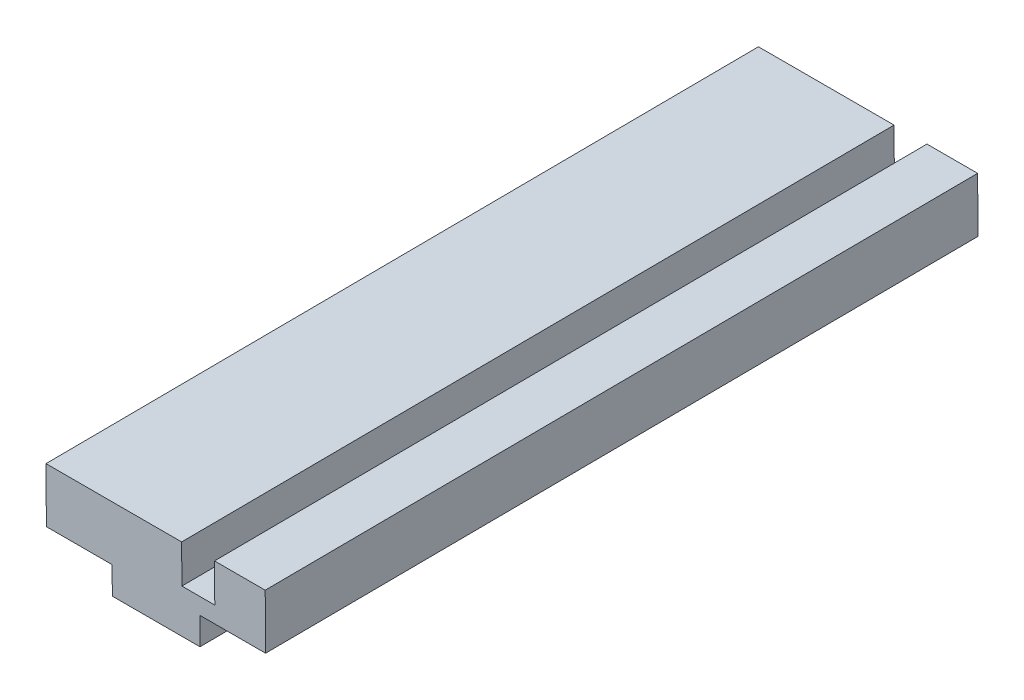
ISO-10303-21;
HEADER;
FILE_DESCRIPTION(('STEP AP214'),'2;1');
FILE_NAME('part.step','',(''),(''),'','','');
FILE_SCHEMA(('AUTOMOTIVE_DESIGN { 1 0 10303 214 1 1 1 1 }'));
ENDSEC;
DATA;
#1=APPLICATION_CONTEXT('core data for automotive mechanical design processes');
#2=APPLICATION_PROTOCOL_DEFINITION('international standard','automotive_design',2000,#1);
#3=PRODUCT_CONTEXT('',#1,'mechanical');
#4=PRODUCT('Part','Part','',(#3));
#5=PRODUCT_RELATED_PRODUCT_CATEGORY('part','',(#4));
#6=PRODUCT_DEFINITION_FORMATION('','',#4);
#7=PRODUCT_DEFINITION_CONTEXT('part definition',#1,'design');
#8=PRODUCT_DEFINITION('design','',#6,#7);
#9=PRODUCT_DEFINITION_SHAPE('','',#8);
#10=(LENGTH_UNIT() NAMED_UNIT(*) SI_UNIT(.MILLI.,.METRE.));
#11=(NAMED_UNIT(*) PLANE_ANGLE_UNIT() SI_UNIT($,.RADIAN.));
#12=(NAMED_UNIT(*) SI_UNIT($,.STERADIAN.) SOLID_ANGLE_UNIT());
#13=UNCERTAINTY_MEASURE_WITH_UNIT(LENGTH_MEASURE(1.E-05),#10,'distance_accuracy_value','');
#14=(GEOMETRIC_REPRESENTATION_CONTEXT(3) GLOBAL_UNCERTAINTY_ASSIGNED_CONTEXT((#13)) GLOBAL_UNIT_ASSIGNED_CONTEXT((#10,
#11,#12)) REPRESENTATION_CONTEXT('',''));
#15=CARTESIAN_POINT('',(0.,0.,0.));
#16=DIRECTION('',(0.,0.,1.));
#17=DIRECTION('',(1.,0.,0.));
#18=AXIS2_PLACEMENT_3D('',#15,#16,#17);
#19=CARTESIAN_POINT('',(0.,10.6828155324661,-140.362156680872));
#20=DIRECTION('',(0.,0.999977218101321,0.00675005765475413));
#21=DIRECTION('',(0.,-0.00675005765475413,0.999977218101321));
#22=AXIS2_PLACEMENT_3D('',#19,#20,#21);
#23=PLANE('',#22);
#24=DIRECTION('',(-1.,0.,0.));
#25=VECTOR('',#24,1.);
#26=CARTESIAN_POINT('',(0.,9.80530803734802,-10.3651183277));
#27=LINE('',#26,#25);
#28=CARTESIAN_POINT('',(7.49999999999996,9.80530803734802,-10.3651183277));
#29=VERTEX_POINT('',#28);
#30=CARTESIAN_POINT('',(-8.50000000000004,9.80530803734802,-10.3651183277));
#31=VERTEX_POINT('',#30);
#32=EDGE_CURVE('E154',#29,#31,#27,.T.);
#33=ORIENTED_EDGE('',*,*,#32,.T.);
#34=DIRECTION('',(0.,-0.00675005765475413,0.999977218101321));
#35=VECTOR('',#34,1.);
#36=CARTESIAN_POINT('',(-8.50000000000007,10.6828155324661,-140.362156680872));
#37=LINE('',#36,#35);
#38=CARTESIAN_POINT('',(-8.50000000000007,10.6828155324661,-140.362156680872));
#39=VERTEX_POINT('',#38);
#40=EDGE_CURVE('E11',#39,#31,#37,.T.);
#41=ORIENTED_EDGE('',*,*,#40,.F.);
#42=DIRECTION('',(-1.,0.,0.));
#43=VECTOR('',#42,1.);
#44=CARTESIAN_POINT('',(0.,10.6828155324661,-140.362156680872));
#45=LINE('',#44,#43);
#46=CARTESIAN_POINT('',(7.49999999999993,10.6828155324661,-140.362156680872));
#47=VERTEX_POINT('',#46);
#48=EDGE_CURVE('E176',#47,#39,#45,.T.);
#49=ORIENTED_EDGE('',*,*,#48,.F.);
#50=DIRECTION('',(0.,-0.00675005765475413,0.999977218101321));
#51=VECTOR('',#50,1.);
#52=CARTESIAN_POINT('',(7.49999999999993,10.6828155324661,-140.362156680872));
#53=LINE('',#52,#51);
#54=EDGE_CURVE('E38',#47,#29,#53,.T.);
#55=ORIENTED_EDGE('',*,*,#54,.T.);
#56=EDGE_LOOP('',(#33,#41,#49,#55));
#57=FACE_BOUND('',#56,.T.);
#58=ADVANCED_FACE('F35',(#57),#23,.F.);
#59=CARTESIAN_POINT('',(-8.50000000000007,0.947917809468825,-140.427869298823));
#60=DIRECTION('',(1.,0.,0.));
#61=DIRECTION('',(0.,0.,-1.));
#62=AXIS2_PLACEMENT_3D('',#59,#60,#61);
#63=PLANE('',#62);
#64=DIRECTION('',(0.,0.999977218101321,0.00675005765475411));
#65=VECTOR('',#64,1.);
#66=CARTESIAN_POINT('',(-8.50000000000004,0.0704103143507889,-10.4308309456516));
#67=LINE('',#66,#65);
#68=CARTESIAN_POINT('',(-8.50000000000004,14.8051941278546,-10.3313680394262));
#69=VERTEX_POINT('',#68);
#70=EDGE_CURVE('E90',#31,#69,#67,.T.);
#71=ORIENTED_EDGE('',*,*,#70,.T.);
#72=DIRECTION('',(0.,-0.00675005765475413,0.999977218101321));
#73=VECTOR('',#72,1.);
#74=CARTESIAN_POINT('',(-8.50000000000007,15.6827016229727,-140.328406392598));
#75=LINE('',#74,#73);
#76=CARTESIAN_POINT('',(-8.50000000000007,15.6827016229727,-140.328406392598));
#77=VERTEX_POINT('',#76);
#78=EDGE_CURVE('E44',#77,#69,#75,.T.);
#79=ORIENTED_EDGE('',*,*,#78,.F.);
#80=DIRECTION('',(0.,0.999977218101321,0.00675005765475411));
#81=VECTOR('',#80,1.);
#82=CARTESIAN_POINT('',(-8.50000000000007,0.947917809468825,-140.427869298823));
#83=LINE('',#82,#81);
#84=EDGE_CURVE('E52',#39,#77,#83,.T.);
#85=ORIENTED_EDGE('',*,*,#84,.F.);
#86=ORIENTED_EDGE('',*,*,#40,.T.);
#87=EDGE_LOOP('',(#71,#79,#85,#86));
#88=FACE_BOUND('',#87,.T.);
#89=ADVANCED_FACE('F221',(#88),#63,.F.);
#90=CARTESIAN_POINT('',(0.,15.6827016229727,-140.328406392598));
#91=DIRECTION('',(0.,0.999977218101321,0.00675005765475413));
#92=DIRECTION('',(0.,-0.00675005765475413,0.999977218101321));
#93=AXIS2_PLACEMENT_3D('',#90,#91,#92);
#94=PLANE('',#93);
#95=DIRECTION('',(-1.,0.,0.));
#96=VECTOR('',#95,1.);
#97=CARTESIAN_POINT('',(0.,14.8051941278546,-10.3313680394262));
#98=LINE('',#97,#96);
#99=CARTESIAN_POINT('',(-20.5,14.8051941278546,-10.3313680394262));
#100=VERTEX_POINT('',#99);
#101=EDGE_CURVE('E139',#69,#100,#98,.T.);
#102=ORIENTED_EDGE('',*,*,#101,.T.);
#103=DIRECTION('',(0.,-0.00675005765475413,0.999977218101321));
#104=VECTOR('',#103,1.);
#105=CARTESIAN_POINT('',(-20.5000000000001,15.6827016229727,-140.328406392598));
#106=LINE('',#105,#104);
#107=CARTESIAN_POINT('',(-20.5000000000001,15.6827016229727,-140.328406392598));
#108=VERTEX_POINT('',#107);
#109=EDGE_CURVE('E137',#108,#100,#106,.T.);
#110=ORIENTED_EDGE('',*,*,#109,.F.);
#111=DIRECTION('',(-1.,0.,0.));
#112=VECTOR('',#111,1.);
#113=CARTESIAN_POINT('',(0.,15.6827016229727,-140.328406392598));
#114=LINE('',#113,#112);
#115=EDGE_CURVE('E128',#77,#108,#114,.T.);
#116=ORIENTED_EDGE('',*,*,#115,.F.);
#117=ORIENTED_EDGE('',*,*,#78,.T.);
#118=EDGE_LOOP('',(#102,#110,#116,#117));
#119=FACE_BOUND('',#118,.T.);
#120=ADVANCED_FACE('F138',(#119),#94,.F.);
#121=CARTESIAN_POINT('',(-20.5000000000001,0.947917809468825,-140.427869298823));
#122=DIRECTION('',(1.,0.,0.));
#123=DIRECTION('',(0.,0.,-1.));
#124=AXIS2_PLACEMENT_3D('',#121,#122,#123);
#125=PLANE('',#124);
#126=DIRECTION('',(0.,0.999977218101321,0.00675005765475411));
#127=VECTOR('',#126,1.);
#128=CARTESIAN_POINT('',(-20.5,0.0704103143507888,-10.4308309456516));
#129=LINE('',#128,#127);
#130=CARTESIAN_POINT('',(-20.5,24.8049663088678,-10.2638674628787));
#131=VERTEX_POINT('',#130);
#132=EDGE_CURVE('E173',#100,#131,#129,.T.);
#133=ORIENTED_EDGE('',*,*,#132,.T.);
#134=DIRECTION('',(0.,-0.00675005765475413,0.999977218101321));
#135=VECTOR('',#134,1.);
#136=CARTESIAN_POINT('',(-20.5000000000001,25.6824738039859,-140.26090581605));
#137=LINE('',#136,#135);
#138=CARTESIAN_POINT('',(-20.5000000000001,25.6824738039859,-140.26090581605));
#139=VERTEX_POINT('',#138);
#140=EDGE_CURVE('E142',#139,#131,#137,.T.);
#141=ORIENTED_EDGE('',*,*,#140,.F.);
#142=DIRECTION('',(0.,0.999977218101321,0.00675005765475411));
#143=VECTOR('',#142,1.);
#144=CARTESIAN_POINT('',(-20.5000000000001,0.947917809468825,-140.427869298823));
#145=LINE('',#144,#143);
#146=EDGE_CURVE('E132',#108,#139,#145,.T.);
#147=ORIENTED_EDGE('',*,*,#146,.F.);
#148=ORIENTED_EDGE('',*,*,#109,.T.);
#149=EDGE_LOOP('',(#133,#141,#147,#148));
#150=FACE_BOUND('',#149,.T.);
#151=ADVANCED_FACE('F144',(#150),#125,.F.);
#152=CARTESIAN_POINT('',(0.,25.6824738039859,-140.26090581605));
#153=DIRECTION('',(0.,-0.999977218101321,-0.00675005765475413));
#154=DIRECTION('',(0.,0.00675005765475413,-0.999977218101321));
#155=AXIS2_PLACEMENT_3D('',#152,#153,#154);
#156=PLANE('',#155);
#157=DIRECTION('',(1.,0.,0.));
#158=VECTOR('',#157,1.);
#159=CARTESIAN_POINT('',(0.,24.8049663088678,-10.2638674628787));
#160=LINE('',#159,#158);
#161=CARTESIAN_POINT('',(4.24994919999996,24.8049663088678,-10.2638674628787));
#162=VERTEX_POINT('',#161);
#163=EDGE_CURVE('E171',#131,#162,#160,.T.);
#164=ORIENTED_EDGE('',*,*,#163,.T.);
#165=DIRECTION('',(0.,-0.00675005765475413,0.999977218101321));
#166=VECTOR('',#165,1.);
#167=CARTESIAN_POINT('',(4.24994919999993,25.6824738039859,-140.26090581605));
#168=LINE('',#167,#166);
#169=CARTESIAN_POINT('',(4.24994919999993,25.6824738039859,-140.26090581605));
#170=VERTEX_POINT('',#169);
#171=EDGE_CURVE('E180',#170,#162,#168,.T.);
#172=ORIENTED_EDGE('',*,*,#171,.F.);
#173=DIRECTION('',(1.,0.,0.));
#174=VECTOR('',#173,1.);
#175=CARTESIAN_POINT('',(0.,25.6824738039859,-140.26090581605));
#176=LINE('',#175,#174);
#177=EDGE_CURVE('E147',#139,#170,#176,.T.);
#178=ORIENTED_EDGE('',*,*,#177,.F.);
#179=ORIENTED_EDGE('',*,*,#140,.T.);
#180=EDGE_LOOP('',(#164,#172,#178,#179));
#181=FACE_BOUND('',#180,.T.);
#182=ADVANCED_FACE('F234',(#181),#156,.F.);
#183=CARTESIAN_POINT('',(4.24994919999991,0.947917809468822,-140.427869298823));
#184=DIRECTION('',(-1.,0.,0.));
#185=DIRECTION('',(0.,-1.,0.));
#186=AXIS2_PLACEMENT_3D('',#183,#184,#185);
#187=PLANE('',#186);
#188=DIRECTION('',(0.,-0.999977218101321,-0.00675005765475411));
#189=VECTOR('',#188,1.);
#190=CARTESIAN_POINT('',(4.24994919999994,0.0704103143507852,-10.4308309456516));
#191=LINE('',#190,#189);
#192=CARTESIAN_POINT('',(4.24994919999996,17.8051257821587,-10.311117866462));
#193=VERTEX_POINT('',#192);
#194=EDGE_CURVE('E169',#162,#193,#191,.T.);
#195=ORIENTED_EDGE('',*,*,#194,.T.);
#196=DIRECTION('',(0.,-0.00675005765475413,0.999977218101321));
#197=VECTOR('',#196,1.);
#198=CARTESIAN_POINT('',(4.24994919999993,18.6826332772767,-140.308156219634));
#199=LINE('',#198,#197);
#200=CARTESIAN_POINT('',(4.24994919999993,18.6826332772767,-140.308156219634));
#201=VERTEX_POINT('',#200);
#202=EDGE_CURVE('E183',#201,#193,#199,.T.);
#203=ORIENTED_EDGE('',*,*,#202,.F.);
#204=DIRECTION('',(0.,-0.999977218101321,-0.00675005765475411));
#205=VECTOR('',#204,1.);
#206=CARTESIAN_POINT('',(4.24994919999991,0.947917809468822,-140.427869298823));
#207=LINE('',#206,#205);
#208=EDGE_CURVE('E149',#170,#201,#207,.T.);
#209=ORIENTED_EDGE('',*,*,#208,.F.);
#210=ORIENTED_EDGE('',*,*,#171,.T.);
#211=EDGE_LOOP('',(#195,#203,#209,#210));
#212=FACE_BOUND('',#211,.T.);
#213=ADVANCED_FACE('F237',(#212),#187,.F.);
#214=CARTESIAN_POINT('',(0.,18.6826332772767,-140.308156219634));
#215=DIRECTION('',(0.,-0.999977218101321,-0.00675005765475413));
#216=DIRECTION('',(0.,0.00675005765475413,-0.999977218101321));
#217=AXIS2_PLACEMENT_3D('',#214,#215,#216);
#218=PLANE('',#217);
#219=DIRECTION('',(1.,0.,0.));
#220=VECTOR('',#219,1.);
#221=CARTESIAN_POINT('',(0.,17.8051257821587,-10.311117866462));
#222=LINE('',#221,#220);
#223=CARTESIAN_POINT('',(10.2499492,17.8051257821587,-10.311117866462));
#224=VERTEX_POINT('',#223);
#225=EDGE_CURVE('E167',#193,#224,#222,.T.);
#226=ORIENTED_EDGE('',*,*,#225,.T.);
#227=DIRECTION('',(0.,-0.00675005765475413,0.999977218101321));
#228=VECTOR('',#227,1.);
#229=CARTESIAN_POINT('',(10.2499491999999,18.6826332772767,-140.308156219634));
#230=LINE('',#229,#228);
#231=CARTESIAN_POINT('',(10.2499491999999,18.6826332772767,-140.308156219634));
#232=VERTEX_POINT('',#231);
#233=EDGE_CURVE('E186',#232,#224,#230,.T.);
#234=ORIENTED_EDGE('',*,*,#233,.F.);
#235=DIRECTION('',(1.,0.,0.));
#236=VECTOR('',#235,1.);
#237=CARTESIAN_POINT('',(0.,18.6826332772767,-140.308156219634));
#238=LINE('',#237,#236);
#239=EDGE_CURVE('E274',#201,#232,#238,.T.);
#240=ORIENTED_EDGE('',*,*,#239,.F.);
#241=ORIENTED_EDGE('',*,*,#202,.T.);
#242=EDGE_LOOP('',(#226,#234,#240,#241));
#243=FACE_BOUND('',#242,.T.);
#244=ADVANCED_FACE('F241',(#243),#218,.F.);
#245=CARTESIAN_POINT('',(10.2499491999999,0.947917809468825,-140.427869298823));
#246=DIRECTION('',(1.,0.,0.));
#247=DIRECTION('',(0.,0.,-1.));
#248=AXIS2_PLACEMENT_3D('',#245,#246,#247);
#249=PLANE('',#248);
#250=DIRECTION('',(0.,0.999977218101321,0.00675005765475411));
#251=VECTOR('',#250,1.);
#252=CARTESIAN_POINT('',(10.2499492,0.0704103143507889,-10.4308309456516));
#253=LINE('',#252,#251);
#254=CARTESIAN_POINT('',(10.2499492,24.8049663088678,-10.2638674628787));
#255=VERTEX_POINT('',#254);
#256=EDGE_CURVE('E165',#224,#255,#253,.T.);
#257=ORIENTED_EDGE('',*,*,#256,.T.);
#258=DIRECTION('',(0.,-0.00675005765475413,0.999977218101321));
#259=VECTOR('',#258,1.);
#260=CARTESIAN_POINT('',(10.2499491999999,25.6824738039859,-140.26090581605));
#261=LINE('',#260,#259);
#262=CARTESIAN_POINT('',(10.2499491999999,25.6824738039859,-140.26090581605));
#263=VERTEX_POINT('',#262);
#264=EDGE_CURVE('E189',#263,#255,#261,.T.);
#265=ORIENTED_EDGE('',*,*,#264,.F.);
#266=DIRECTION('',(0.,0.999977218101321,0.00675005765475411));
#267=VECTOR('',#266,1.);
#268=CARTESIAN_POINT('',(10.2499491999999,0.947917809468825,-140.427869298823));
#269=LINE('',#268,#267);
#270=EDGE_CURVE('E272',#232,#263,#269,.T.);
#271=ORIENTED_EDGE('',*,*,#270,.F.);
#272=ORIENTED_EDGE('',*,*,#233,.T.);
#273=EDGE_LOOP('',(#257,#265,#271,#272));
#274=FACE_BOUND('',#273,.T.);
#275=ADVANCED_FACE('F245',(#274),#249,.F.);
#276=CARTESIAN_POINT('',(0.,25.6824738039859,-140.26090581605));
#277=DIRECTION('',(0.,-0.999977218101321,-0.00675005765475413));
#278=DIRECTION('',(0.,0.00675005765475413,-0.999977218101321));
#279=AXIS2_PLACEMENT_3D('',#276,#277,#278);
#280=PLANE('',#279);
#281=DIRECTION('',(1.,0.,0.));
#282=VECTOR('',#281,1.);
#283=CARTESIAN_POINT('',(0.,24.8049663088678,-10.2638674628787));
#284=LINE('',#283,#282);
#285=CARTESIAN_POINT('',(19.5,24.8049663088678,-10.2638674628787));
#286=VERTEX_POINT('',#285);
#287=EDGE_CURVE('E163',#255,#286,#284,.T.);
#288=ORIENTED_EDGE('',*,*,#287,.T.);
#289=DIRECTION('',(0.,-0.00675005765475413,0.999977218101321));
#290=VECTOR('',#289,1.);
#291=CARTESIAN_POINT('',(19.4999999999999,25.6824738039859,-140.26090581605));
#292=LINE('',#291,#290);
#293=CARTESIAN_POINT('',(19.4999999999999,25.6824738039859,-140.26090581605));
#294=VERTEX_POINT('',#293);
#295=EDGE_CURVE('E192',#294,#286,#292,.T.);
#296=ORIENTED_EDGE('',*,*,#295,.F.);
#297=DIRECTION('',(1.,0.,0.));
#298=VECTOR('',#297,1.);
#299=CARTESIAN_POINT('',(0.,25.6824738039859,-140.26090581605));
#300=LINE('',#299,#298);
#301=EDGE_CURVE('E266',#263,#294,#300,.T.);
#302=ORIENTED_EDGE('',*,*,#301,.F.);
#303=ORIENTED_EDGE('',*,*,#264,.T.);
#304=EDGE_LOOP('',(#288,#296,#302,#303));
#305=FACE_BOUND('',#304,.T.);
#306=ADVANCED_FACE('F249',(#305),#280,.F.);
#307=CARTESIAN_POINT('',(19.4999999999999,0.947917809468825,-140.427869298823));
#308=DIRECTION('',(-1.,0.,0.));
#309=DIRECTION('',(0.,0.,1.));
#310=AXIS2_PLACEMENT_3D('',#307,#308,#309);
#311=PLANE('',#310);
#312=DIRECTION('',(0.,-0.999977218101321,-0.00675005765475411));
#313=VECTOR('',#312,1.);
#314=CARTESIAN_POINT('',(19.5,0.0704103143507889,-10.4308309456516));
#315=LINE('',#314,#313);
#316=CARTESIAN_POINT('',(19.5,14.8051941278546,-10.3313680394262));
#317=VERTEX_POINT('',#316);
#318=EDGE_CURVE('E161',#286,#317,#315,.T.);
#319=ORIENTED_EDGE('',*,*,#318,.T.);
#320=DIRECTION('',(0.,-0.00675005765475413,0.999977218101321));
#321=VECTOR('',#320,1.);
#322=CARTESIAN_POINT('',(19.4999999999999,15.6827016229727,-140.328406392598));
#323=LINE('',#322,#321);
#324=CARTESIAN_POINT('',(19.4999999999999,15.6827016229727,-140.328406392598));
#325=VERTEX_POINT('',#324);
#326=EDGE_CURVE('E195',#325,#317,#323,.T.);
#327=ORIENTED_EDGE('',*,*,#326,.F.);
#328=DIRECTION('',(0.,-0.999977218101321,-0.00675005765475411));
#329=VECTOR('',#328,1.);
#330=CARTESIAN_POINT('',(19.4999999999999,0.947917809468825,-140.427869298823));
#331=LINE('',#330,#329);
#332=EDGE_CURVE('E264',#294,#325,#331,.T.);
#333=ORIENTED_EDGE('',*,*,#332,.F.);
#334=ORIENTED_EDGE('',*,*,#295,.T.);
#335=EDGE_LOOP('',(#319,#327,#333,#334));
#336=FACE_BOUND('',#335,.T.);
#337=ADVANCED_FACE('F217',(#336),#311,.F.);
#338=CARTESIAN_POINT('',(0.,15.6827016229727,-140.328406392598));
#339=DIRECTION('',(0.,0.999977218101321,0.00675005765475413));
#340=DIRECTION('',(0.,-0.00675005765475413,0.999977218101321));
#341=AXIS2_PLACEMENT_3D('',#338,#339,#340);
#342=PLANE('',#341);
#343=DIRECTION('',(-1.,0.,0.));
#344=VECTOR('',#343,1.);
#345=CARTESIAN_POINT('',(0.,14.8051941278546,-10.3313680394262));
#346=LINE('',#345,#344);
#347=CARTESIAN_POINT('',(7.49999999999996,14.8051941278546,-10.3313680394262));
#348=VERTEX_POINT('',#347);
#349=EDGE_CURVE('E159',#317,#348,#346,.T.);
#350=ORIENTED_EDGE('',*,*,#349,.T.);
#351=DIRECTION('',(0.,-0.00675005765475413,0.999977218101321));
#352=VECTOR('',#351,1.);
#353=CARTESIAN_POINT('',(7.49999999999993,15.6827016229727,-140.328406392598));
#354=LINE('',#353,#352);
#355=CARTESIAN_POINT('',(7.49999999999993,15.6827016229727,-140.328406392598));
#356=VERTEX_POINT('',#355);
#357=EDGE_CURVE('E197',#356,#348,#354,.T.);
#358=ORIENTED_EDGE('',*,*,#357,.F.);
#359=DIRECTION('',(-1.,0.,0.));
#360=VECTOR('',#359,1.);
#361=CARTESIAN_POINT('',(0.,15.6827016229727,-140.328406392598));
#362=LINE('',#361,#360);
#363=EDGE_CURVE('E263',#325,#356,#362,.T.);
#364=ORIENTED_EDGE('',*,*,#363,.F.);
#365=ORIENTED_EDGE('',*,*,#326,.T.);
#366=EDGE_LOOP('',(#350,#358,#364,#365));
#367=FACE_BOUND('',#366,.T.);
#368=ADVANCED_FACE('F211',(#367),#342,.F.);
#369=CARTESIAN_POINT('',(7.49999999999993,0.947917809468825,-140.427869298823));
#370=DIRECTION('',(-1.,0.,0.));
#371=DIRECTION('',(0.,0.,1.));
#372=AXIS2_PLACEMENT_3D('',#369,#370,#371);
#373=PLANE('',#372);
#374=DIRECTION('',(0.,-0.999977218101321,-0.00675005765475411));
#375=VECTOR('',#374,1.);
#376=CARTESIAN_POINT('',(7.49999999999996,0.0704103143507889,-10.4308309456516));
#377=LINE('',#376,#375);
#378=EDGE_CURVE('E157',#348,#29,#377,.T.);
#379=ORIENTED_EDGE('',*,*,#378,.T.);
#380=ORIENTED_EDGE('',*,*,#54,.F.);
#381=DIRECTION('',(0.,-0.999977218101321,-0.00675005765475411));
#382=VECTOR('',#381,1.);
#383=CARTESIAN_POINT('',(7.49999999999993,0.947917809468825,-140.427869298823));
#384=LINE('',#383,#382);
#385=EDGE_CURVE('E102',#356,#47,#384,.T.);
#386=ORIENTED_EDGE('',*,*,#385,.F.);
#387=ORIENTED_EDGE('',*,*,#357,.T.);
#388=EDGE_LOOP('',(#379,#380,#386,#387));
#389=FACE_BOUND('',#388,.T.);
#390=ADVANCED_FACE('F209',(#389),#373,.F.);
#391=CARTESIAN_POINT('',(0.,0.947917809468825,-140.427869298823));
#392=DIRECTION('',(0.,-0.00675005765475411,0.999977218101321));
#393=DIRECTION('',(0.,-0.999977218101321,-0.00675005765475411));
#394=AXIS2_PLACEMENT_3D('',#391,#392,#393);
#395=PLANE('',#394);
#396=ORIENTED_EDGE('',*,*,#48,.T.);
#397=ORIENTED_EDGE('',*,*,#84,.T.);
#398=ORIENTED_EDGE('',*,*,#115,.T.);
#399=ORIENTED_EDGE('',*,*,#146,.T.);
#400=ORIENTED_EDGE('',*,*,#177,.T.);
#401=ORIENTED_EDGE('',*,*,#208,.T.);
#402=ORIENTED_EDGE('',*,*,#239,.T.);
#403=ORIENTED_EDGE('',*,*,#270,.T.);
#404=ORIENTED_EDGE('',*,*,#301,.T.);
#405=ORIENTED_EDGE('',*,*,#332,.T.);
#406=ORIENTED_EDGE('',*,*,#363,.T.);
#407=ORIENTED_EDGE('',*,*,#385,.T.);
#408=EDGE_LOOP('',(#396,#397,#398,#399,#400,#401,#402,#403,#404,#405,#406,#407));
#409=FACE_BOUND('',#408,.T.);
#410=ADVANCED_FACE('F130',(#409),#395,.F.);
#411=CARTESIAN_POINT('',(0.,0.0704103143507889,-10.4308309456516));
#412=DIRECTION('',(0.,-0.00675005765475411,0.999977218101321));
#413=DIRECTION('',(0.,-0.999977218101321,-0.00675005765475411));
#414=AXIS2_PLACEMENT_3D('',#411,#412,#413);
#415=PLANE('',#414);
#416=ORIENTED_EDGE('',*,*,#32,.F.);
#417=ORIENTED_EDGE('',*,*,#378,.F.);
#418=ORIENTED_EDGE('',*,*,#349,.F.);
#419=ORIENTED_EDGE('',*,*,#318,.F.);
#420=ORIENTED_EDGE('',*,*,#287,.F.);
#421=ORIENTED_EDGE('',*,*,#256,.F.);
#422=ORIENTED_EDGE('',*,*,#225,.F.);
#423=ORIENTED_EDGE('',*,*,#194,.F.);
#424=ORIENTED_EDGE('',*,*,#163,.F.);
#425=ORIENTED_EDGE('',*,*,#132,.F.);
#426=ORIENTED_EDGE('',*,*,#101,.F.);
#427=ORIENTED_EDGE('',*,*,#70,.F.);
#428=EDGE_LOOP('',(#416,#417,#418,#419,#420,#421,#422,#423,#424,#425,#426,#427));
#429=FACE_BOUND('',#428,.T.);
#430=ADVANCED_FACE('F206',(#429),#415,.T.);
#431=CLOSED_SHELL('',(#58,#89,#120,#151,#182,#213,#244,#275,#306,#337,#368,#390,#410,#430));
#432=MANIFOLD_SOLID_BREP('B2',#431);
#433=ADVANCED_BREP_SHAPE_REPRESENTATION('',(#18,#432),#14);
#434=SHAPE_DEFINITION_REPRESENTATION(#9,#433);
ENDSEC;
END-ISO-10303-21;
